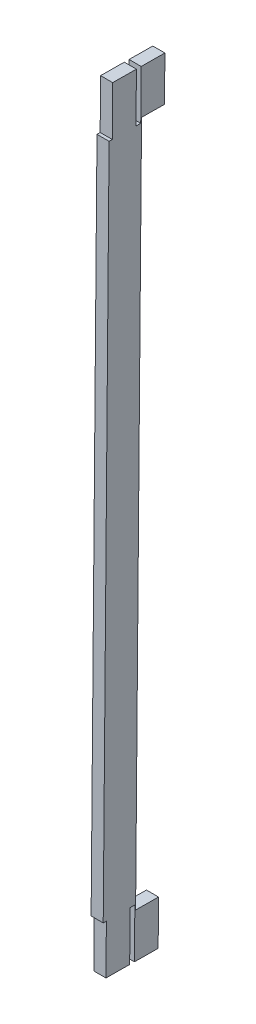
ISO-10303-21;
HEADER;
FILE_DESCRIPTION(('STEP AP214'),'2;1');
FILE_NAME('part.step','',(''),(''),'','','');
FILE_SCHEMA(('AUTOMOTIVE_DESIGN { 1 0 10303 214 1 1 1 1 }'));
ENDSEC;
DATA;
#1=APPLICATION_CONTEXT('core data for automotive mechanical design processes');
#2=APPLICATION_PROTOCOL_DEFINITION('international standard','automotive_design',2000,#1);
#3=PRODUCT_CONTEXT('',#1,'mechanical');
#4=PRODUCT('Part','Part','',(#3));
#5=PRODUCT_RELATED_PRODUCT_CATEGORY('part','',(#4));
#6=PRODUCT_DEFINITION_FORMATION('','',#4);
#7=PRODUCT_DEFINITION_CONTEXT('part definition',#1,'design');
#8=PRODUCT_DEFINITION('design','',#6,#7);
#9=PRODUCT_DEFINITION_SHAPE('','',#8);
#10=(LENGTH_UNIT() NAMED_UNIT(*) SI_UNIT(.MILLI.,.METRE.));
#11=(NAMED_UNIT(*) PLANE_ANGLE_UNIT() SI_UNIT($,.RADIAN.));
#12=(NAMED_UNIT(*) SI_UNIT($,.STERADIAN.) SOLID_ANGLE_UNIT());
#13=UNCERTAINTY_MEASURE_WITH_UNIT(LENGTH_MEASURE(1.E-05),#10,'distance_accuracy_value','');
#14=(GEOMETRIC_REPRESENTATION_CONTEXT(3) GLOBAL_UNCERTAINTY_ASSIGNED_CONTEXT((#13)) GLOBAL_UNIT_ASSIGNED_CONTEXT((#10,
#11,#12)) REPRESENTATION_CONTEXT('',''));
#15=CARTESIAN_POINT('',(0.,0.,0.));
#16=DIRECTION('',(0.,0.,1.));
#17=DIRECTION('',(1.,0.,0.));
#18=AXIS2_PLACEMENT_3D('',#15,#16,#17);
#19=CARTESIAN_POINT('',(445.899457677506,737.587476693191,961.484141215492));
#20=DIRECTION('',(0.,-0.00872653549836428,-0.999961923064171));
#21=DIRECTION('',(0.,0.999961923064171,-0.00872653549836428));
#22=AXIS2_PLACEMENT_3D('',#19,#20,#21);
#23=PLANE('',#22);
#24=DIRECTION('',(0.,0.999961923064171,-0.00872653549836428));
#25=VECTOR('',#24,1.);
#26=CARTESIAN_POINT('',(453.543651110175,737.587476693191,961.484141215492));
#27=LINE('',#26,#25);
#28=CARTESIAN_POINT('',(453.543651110175,493.596767465534,963.613415877093));
#29=VERTEX_POINT('',#28);
#30=CARTESIAN_POINT('',(453.543651110175,521.59570131133,963.369072883139));
#31=VERTEX_POINT('',#30);
#32=EDGE_CURVE('E184',#29,#31,#27,.T.);
#33=ORIENTED_EDGE('',*,*,#32,.F.);
#34=DIRECTION('',(1.,0.,0.));
#35=VECTOR('',#34,1.);
#36=CARTESIAN_POINT('',(445.899457677506,493.596767465534,963.613415877093));
#37=LINE('',#36,#35);
#38=CARTESIAN_POINT('',(445.899457677506,493.596767465534,963.613415877093));
#39=VERTEX_POINT('',#38);
#40=EDGE_CURVE('E32',#39,#29,#37,.T.);
#41=ORIENTED_EDGE('',*,*,#40,.F.);
#42=DIRECTION('',(0.,0.999961923064171,-0.00872653549836428));
#43=VECTOR('',#42,1.);
#44=CARTESIAN_POINT('',(445.899457677506,737.587476693191,961.484141215492));
#45=LINE('',#44,#43);
#46=CARTESIAN_POINT('',(445.899457677506,521.59570131133,963.369072883139));
#47=VERTEX_POINT('',#46);
#48=EDGE_CURVE('E240',#39,#47,#45,.T.);
#49=ORIENTED_EDGE('',*,*,#48,.T.);
#50=DIRECTION('',(1.,0.,0.));
#51=VECTOR('',#50,1.);
#52=CARTESIAN_POINT('',(445.899457677506,521.59570131133,963.369072883139));
#53=LINE('',#52,#51);
#54=EDGE_CURVE('E10',#47,#31,#53,.T.);
#55=ORIENTED_EDGE('',*,*,#54,.T.);
#56=EDGE_LOOP('',(#33,#41,#49,#55));
#57=FACE_BOUND('',#56,.T.);
#58=ADVANCED_FACE('F16',(#57),#23,.T.);
#59=CARTESIAN_POINT('',(445.899457677506,519.83730440841,761.876745385709));
#60=DIRECTION('',(0.,0.999961923064171,-0.008726535498364));
#61=DIRECTION('',(0.,0.008726535498364,0.999961923064171));
#62=AXIS2_PLACEMENT_3D('',#59,#60,#61);
#63=PLANE('',#62);
#64=DIRECTION('',(0.,0.008726535498364,0.999961923064171));
#65=VECTOR('',#64,1.);
#66=CARTESIAN_POINT('',(453.543651110175,519.83730440841,761.876745385709));
#67=LINE('',#66,#65);
#68=CARTESIAN_POINT('',(453.543651110175,521.722236076056,977.86852076757));
#69=VERTEX_POINT('',#68);
#70=EDGE_CURVE('E187',#31,#69,#67,.T.);
#71=ORIENTED_EDGE('',*,*,#70,.F.);
#72=ORIENTED_EDGE('',*,*,#54,.F.);
#73=DIRECTION('',(0.,0.008726535498364,0.999961923064171));
#74=VECTOR('',#73,1.);
#75=CARTESIAN_POINT('',(445.899457677506,519.83730440841,761.876745385709));
#76=LINE('',#75,#74);
#77=CARTESIAN_POINT('',(445.899457677506,521.722236076056,977.86852076757));
#78=VERTEX_POINT('',#77);
#79=EDGE_CURVE('E273',#47,#78,#76,.T.);
#80=ORIENTED_EDGE('',*,*,#79,.T.);
#81=DIRECTION('',(1.,0.,0.));
#82=VECTOR('',#81,1.);
#83=CARTESIAN_POINT('',(445.899457677506,521.722236076056,977.86852076757));
#84=LINE('',#83,#82);
#85=EDGE_CURVE('E24',#78,#69,#84,.T.);
#86=ORIENTED_EDGE('',*,*,#85,.T.);
#87=EDGE_LOOP('',(#71,#72,#80,#86));
#88=FACE_BOUND('',#87,.T.);
#89=ADVANCED_FACE('F272',(#88),#63,.T.);
#90=CARTESIAN_POINT('',(445.899457677506,737.714011457917,975.983589099923));
#91=DIRECTION('',(0.,-0.008726535498364,-0.999961923064171));
#92=DIRECTION('',(0.,0.999961923064171,-0.008726535498364));
#93=AXIS2_PLACEMENT_3D('',#90,#91,#92);
#94=PLANE('',#93);
#95=DIRECTION('',(0.,0.999961923064171,-0.008726535498364));
#96=VECTOR('',#95,1.);
#97=CARTESIAN_POINT('',(453.543651110175,737.714011457917,975.983589099923));
#98=LINE('',#97,#96);
#99=CARTESIAN_POINT('',(453.543651110175,953.705786839779,974.098657432277));
#100=VERTEX_POINT('',#99);
#101=EDGE_CURVE('E190',#69,#100,#98,.T.);
#102=ORIENTED_EDGE('',*,*,#101,.F.);
#103=ORIENTED_EDGE('',*,*,#85,.F.);
#104=DIRECTION('',(0.,0.999961923064171,-0.008726535498364));
#105=VECTOR('',#104,1.);
#106=CARTESIAN_POINT('',(445.899457677506,737.714011457917,975.983589099923));
#107=LINE('',#106,#105);
#108=CARTESIAN_POINT('',(445.899457677506,953.705786839779,974.098657432277));
#109=VERTEX_POINT('',#108);
#110=EDGE_CURVE('E282',#78,#109,#107,.T.);
#111=ORIENTED_EDGE('',*,*,#110,.T.);
#112=DIRECTION('',(1.,0.,0.));
#113=VECTOR('',#112,1.);
#114=CARTESIAN_POINT('',(445.899457677506,953.705786839779,974.098657432277));
#115=LINE('',#114,#113);
#116=EDGE_CURVE('E270',#109,#100,#115,.T.);
#117=ORIENTED_EDGE('',*,*,#116,.T.);
#118=EDGE_LOOP('',(#102,#103,#111,#117));
#119=FACE_BOUND('',#118,.T.);
#120=ADVANCED_FACE('F277',(#119),#94,.T.);
#121=CARTESIAN_POINT('',(445.899457677506,951.820855172132,758.106882050416));
#122=DIRECTION('',(0.,-0.999961923064171,0.008726535498364));
#123=DIRECTION('',(0.,-0.008726535498364,-0.999961923064171));
#124=AXIS2_PLACEMENT_3D('',#121,#122,#123);
#125=PLANE('',#124);
#126=DIRECTION('',(0.,-0.008726535498364,-0.999961923064171));
#127=VECTOR('',#126,1.);
#128=CARTESIAN_POINT('',(453.543651110175,951.820855172132,758.106882050416));
#129=LINE('',#128,#127);
#130=CARTESIAN_POINT('',(453.543651110175,953.579252075052,959.599209547846));
#131=VERTEX_POINT('',#130);
#132=EDGE_CURVE('E193',#100,#131,#129,.T.);
#133=ORIENTED_EDGE('',*,*,#132,.F.);
#134=ORIENTED_EDGE('',*,*,#116,.F.);
#135=DIRECTION('',(0.,-0.008726535498364,-0.999961923064171));
#136=VECTOR('',#135,1.);
#137=CARTESIAN_POINT('',(445.899457677506,951.820855172132,758.106882050416));
#138=LINE('',#137,#136);
#139=CARTESIAN_POINT('',(445.899457677506,953.579252075052,959.599209547846));
#140=VERTEX_POINT('',#139);
#141=EDGE_CURVE('E286',#109,#140,#138,.T.);
#142=ORIENTED_EDGE('',*,*,#141,.T.);
#143=DIRECTION('',(1.,0.,0.));
#144=VECTOR('',#143,1.);
#145=CARTESIAN_POINT('',(445.899457677506,953.579252075052,959.599209547846));
#146=LINE('',#145,#144);
#147=EDGE_CURVE('E268',#140,#131,#146,.T.);
#148=ORIENTED_EDGE('',*,*,#147,.T.);
#149=EDGE_LOOP('',(#133,#134,#142,#148));
#150=FACE_BOUND('',#149,.T.);
#151=ADVANCED_FACE('F377',(#150),#125,.T.);
#152=CARTESIAN_POINT('',(445.899457677506,737.587476693191,961.484141215493));
#153=DIRECTION('',(0.,-0.00872653549836404,-0.999961923064171));
#154=DIRECTION('',(0.,0.999961923064171,-0.00872653549836404));
#155=AXIS2_PLACEMENT_3D('',#152,#153,#154);
#156=PLANE('',#155);
#157=DIRECTION('',(0.,0.999961923064171,-0.00872653549836404));
#158=VECTOR('',#157,1.);
#159=CARTESIAN_POINT('',(453.543651110175,737.587476693191,961.484141215493));
#160=LINE('',#159,#158);
#161=CARTESIAN_POINT('',(453.543651110175,981.57818592085,959.354866553892));
#162=VERTEX_POINT('',#161);
#163=EDGE_CURVE('E196',#131,#162,#160,.T.);
#164=ORIENTED_EDGE('',*,*,#163,.F.);
#165=ORIENTED_EDGE('',*,*,#147,.F.);
#166=DIRECTION('',(0.,0.999961923064171,-0.00872653549836404));
#167=VECTOR('',#166,1.);
#168=CARTESIAN_POINT('',(445.899457677506,737.587476693191,961.484141215493));
#169=LINE('',#168,#167);
#170=CARTESIAN_POINT('',(445.899457677506,981.57818592085,959.354866553892));
#171=VERTEX_POINT('',#170);
#172=EDGE_CURVE('E289',#140,#171,#169,.T.);
#173=ORIENTED_EDGE('',*,*,#172,.T.);
#174=DIRECTION('',(1.,0.,0.));
#175=VECTOR('',#174,1.);
#176=CARTESIAN_POINT('',(445.899457677506,981.57818592085,959.354866553892));
#177=LINE('',#176,#175);
#178=EDGE_CURVE('E266',#171,#162,#177,.T.);
#179=ORIENTED_EDGE('',*,*,#178,.T.);
#180=EDGE_LOOP('',(#164,#165,#173,#179));
#181=FACE_BOUND('',#180,.T.);
#182=ADVANCED_FACE('F374',(#181),#156,.T.);
#183=CARTESIAN_POINT('',(445.899457677506,979.81978901793,757.862539056462));
#184=DIRECTION('',(0.,0.999961923064171,-0.00872653549836404));
#185=DIRECTION('',(0.,0.00872653549836404,0.999961923064171));
#186=AXIS2_PLACEMENT_3D('',#183,#184,#185);
#187=PLANE('',#186);
#188=DIRECTION('',(0.,0.00872653549836404,0.999961923064171));
#189=VECTOR('',#188,1.);
#190=CARTESIAN_POINT('',(453.543651110175,979.81978901793,757.862539056462));
#191=LINE('',#190,#189);
#192=CARTESIAN_POINT('',(453.543651110175,981.709083953326,974.354295399855));
#193=VERTEX_POINT('',#192);
#194=EDGE_CURVE('E199',#162,#193,#191,.T.);
#195=ORIENTED_EDGE('',*,*,#194,.F.);
#196=ORIENTED_EDGE('',*,*,#178,.F.);
#197=DIRECTION('',(0.,0.00872653549836404,0.999961923064171));
#198=VECTOR('',#197,1.);
#199=CARTESIAN_POINT('',(445.899457677506,979.81978901793,757.862539056462));
#200=LINE('',#199,#198);
#201=CARTESIAN_POINT('',(445.899457677506,981.709083953326,974.354295399855));
#202=VERTEX_POINT('',#201);
#203=EDGE_CURVE('E292',#171,#202,#200,.T.);
#204=ORIENTED_EDGE('',*,*,#203,.T.);
#205=DIRECTION('',(1.,0.,0.));
#206=VECTOR('',#205,1.);
#207=CARTESIAN_POINT('',(445.899457677506,981.709083953326,974.354295399855));
#208=LINE('',#207,#206);
#209=EDGE_CURVE('E264',#202,#193,#208,.T.);
#210=ORIENTED_EDGE('',*,*,#209,.T.);
#211=EDGE_LOOP('',(#195,#196,#204,#210));
#212=FACE_BOUND('',#211,.T.);
#213=ADVANCED_FACE('F371',(#212),#187,.T.);
#214=CARTESIAN_POINT('',(445.899457677506,737.718374725667,976.483570061455));
#215=DIRECTION('',(0.,0.00872653549836404,0.999961923064171));
#216=DIRECTION('',(0.,-0.999961923064171,0.00872653549836404));
#217=AXIS2_PLACEMENT_3D('',#214,#215,#216);
#218=PLANE('',#217);
#219=DIRECTION('',(0.,-0.999961923064171,0.00872653549836404));
#220=VECTOR('',#219,1.);
#221=CARTESIAN_POINT('',(453.543651110175,737.718374725667,976.483570061455));
#222=LINE('',#221,#220);
#223=CARTESIAN_POINT('',(453.543651110175,950.710264338337,974.624818000304));
#224=VERTEX_POINT('',#223);
#225=EDGE_CURVE('E202',#193,#224,#222,.T.);
#226=ORIENTED_EDGE('',*,*,#225,.F.);
#227=ORIENTED_EDGE('',*,*,#209,.F.);
#228=DIRECTION('',(0.,-0.999961923064171,0.00872653549836404));
#229=VECTOR('',#228,1.);
#230=CARTESIAN_POINT('',(445.899457677506,737.718374725667,976.483570061455));
#231=LINE('',#230,#229);
#232=CARTESIAN_POINT('',(445.899457677506,950.710264338337,974.624818000304));
#233=VERTEX_POINT('',#232);
#234=EDGE_CURVE('E295',#202,#233,#231,.T.);
#235=ORIENTED_EDGE('',*,*,#234,.T.);
#236=DIRECTION('',(1.,0.,0.));
#237=VECTOR('',#236,1.);
#238=CARTESIAN_POINT('',(445.899457677506,950.710264338337,974.624818000304));
#239=LINE('',#238,#237);
#240=EDGE_CURVE('E262',#233,#224,#239,.T.);
#241=ORIENTED_EDGE('',*,*,#240,.T.);
#242=EDGE_LOOP('',(#226,#227,#235,#241));
#243=FACE_BOUND('',#242,.T.);
#244=ADVANCED_FACE('F368',(#243),#218,.T.);
#245=CARTESIAN_POINT('',(445.899457677506,948.820969402941,758.133061656911));
#246=DIRECTION('',(0.,-0.999961923064171,0.00872653549836404));
#247=DIRECTION('',(0.,-0.00872653549836404,-0.999961923064171));
#248=AXIS2_PLACEMENT_3D('',#245,#246,#247);
#249=PLANE('',#248);
#250=DIRECTION('',(0.,-0.00872653549836404,-0.999961923064171));
#251=VECTOR('',#250,1.);
#252=CARTESIAN_POINT('',(453.543651110175,948.820969402941,758.133061656911));
#253=LINE('',#252,#251);
#254=CARTESIAN_POINT('',(453.543651110175,950.736443944832,977.624703769496));
#255=VERTEX_POINT('',#254);
#256=EDGE_CURVE('E205',#255,#224,#253,.T.);
#257=ORIENTED_EDGE('',*,*,#256,.T.);
#258=ORIENTED_EDGE('',*,*,#240,.F.);
#259=DIRECTION('',(0.,-0.00872653549836404,-0.999961923064171));
#260=VECTOR('',#259,1.);
#261=CARTESIAN_POINT('',(445.899457677506,948.820969402941,758.133061656911));
#262=LINE('',#261,#260);
#263=CARTESIAN_POINT('',(445.899457677506,950.736443944832,977.624703769496));
#264=VERTEX_POINT('',#263);
#265=EDGE_CURVE('E298',#264,#233,#262,.T.);
#266=ORIENTED_EDGE('',*,*,#265,.F.);
#267=DIRECTION('',(1.,0.,0.));
#268=VECTOR('',#267,1.);
#269=CARTESIAN_POINT('',(445.899457677506,950.736443944832,977.624703769496));
#270=LINE('',#269,#268);
#271=EDGE_CURVE('E260',#264,#255,#270,.T.);
#272=ORIENTED_EDGE('',*,*,#271,.T.);
#273=EDGE_LOOP('',(#257,#258,#266,#272));
#274=FACE_BOUND('',#273,.T.);
#275=ADVANCED_FACE('F362',(#274),#249,.F.);
#276=CARTESIAN_POINT('',(445.899457677506,737.744554332162,979.483455830648));
#277=DIRECTION('',(0.,-0.00872653549836404,-0.999961923064171));
#278=DIRECTION('',(0.,0.999961923064171,-0.00872653549836404));
#279=AXIS2_PLACEMENT_3D('',#276,#277,#278);
#280=PLANE('',#279);
#281=DIRECTION('',(0.,0.999961923064171,-0.00872653549836404));
#282=VECTOR('',#281,1.);
#283=CARTESIAN_POINT('',(453.543651110175,737.744554332162,979.483455830648));
#284=LINE('',#283,#282);
#285=CARTESIAN_POINT('',(453.543651110175,981.735263559821,977.354181169047));
#286=VERTEX_POINT('',#285);
#287=EDGE_CURVE('E208',#255,#286,#284,.T.);
#288=ORIENTED_EDGE('',*,*,#287,.F.);
#289=ORIENTED_EDGE('',*,*,#271,.F.);
#290=DIRECTION('',(0.,0.999961923064171,-0.00872653549836404));
#291=VECTOR('',#290,1.);
#292=CARTESIAN_POINT('',(445.899457677506,737.744554332162,979.483455830648));
#293=LINE('',#292,#291);
#294=CARTESIAN_POINT('',(445.899457677506,981.735263559821,977.354181169047));
#295=VERTEX_POINT('',#294);
#296=EDGE_CURVE('E301',#264,#295,#293,.T.);
#297=ORIENTED_EDGE('',*,*,#296,.T.);
#298=DIRECTION('',(1.,0.,0.));
#299=VECTOR('',#298,1.);
#300=CARTESIAN_POINT('',(445.899457677506,981.735263559821,977.354181169047));
#301=LINE('',#300,#299);
#302=EDGE_CURVE('E258',#295,#286,#301,.T.);
#303=ORIENTED_EDGE('',*,*,#302,.T.);
#304=EDGE_LOOP('',(#288,#289,#297,#303));
#305=FACE_BOUND('',#304,.T.);
#306=ADVANCED_FACE('F358',(#305),#280,.T.);
#307=CARTESIAN_POINT('',(445.899457677506,979.81978901793,757.862539056462));
#308=DIRECTION('',(0.,0.999961923064171,-0.00872653549836404));
#309=DIRECTION('',(0.,0.00872653549836404,0.999961923064171));
#310=AXIS2_PLACEMENT_3D('',#307,#308,#309);
#311=PLANE('',#310);
#312=DIRECTION('',(0.,0.00872653549836404,0.999961923064171));
#313=VECTOR('',#312,1.);
#314=CARTESIAN_POINT('',(453.543651110175,979.81978901793,757.862539056462));
#315=LINE('',#314,#313);
#316=CARTESIAN_POINT('',(453.543651110175,981.866161592296,992.35361001501));
#317=VERTEX_POINT('',#316);
#318=EDGE_CURVE('E211',#286,#317,#315,.T.);
#319=ORIENTED_EDGE('',*,*,#318,.F.);
#320=ORIENTED_EDGE('',*,*,#302,.F.);
#321=DIRECTION('',(0.,0.00872653549836404,0.999961923064171));
#322=VECTOR('',#321,1.);
#323=CARTESIAN_POINT('',(445.899457677506,979.81978901793,757.862539056462));
#324=LINE('',#323,#322);
#325=CARTESIAN_POINT('',(445.899457677506,981.866161592296,992.35361001501));
#326=VERTEX_POINT('',#325);
#327=EDGE_CURVE('E304',#295,#326,#324,.T.);
#328=ORIENTED_EDGE('',*,*,#327,.T.);
#329=DIRECTION('',(1.,0.,0.));
#330=VECTOR('',#329,1.);
#331=CARTESIAN_POINT('',(445.899457677506,981.866161592296,992.35361001501));
#332=LINE('',#331,#330);
#333=EDGE_CURVE('E256',#326,#317,#332,.T.);
#334=ORIENTED_EDGE('',*,*,#333,.T.);
#335=EDGE_LOOP('',(#319,#320,#328,#334));
#336=FACE_BOUND('',#335,.T.);
#337=ADVANCED_FACE('F355',(#336),#311,.T.);
#338=CARTESIAN_POINT('',(445.899457677506,737.875452364637,994.482884676611));
#339=DIRECTION('',(0.,0.00872653549836404,0.999961923064171));
#340=DIRECTION('',(0.,-0.999961923064171,0.00872653549836404));
#341=AXIS2_PLACEMENT_3D('',#338,#339,#340);
#342=PLANE('',#341);
#343=DIRECTION('',(0.,-0.999961923064171,0.00872653549836404));
#344=VECTOR('',#343,1.);
#345=CARTESIAN_POINT('',(453.543651110175,737.875452364637,994.482884676611));
#346=LINE('',#345,#344);
#347=CARTESIAN_POINT('',(453.543651110175,950.867341977307,992.624132615459));
#348=VERTEX_POINT('',#347);
#349=EDGE_CURVE('E214',#317,#348,#346,.T.);
#350=ORIENTED_EDGE('',*,*,#349,.F.);
#351=ORIENTED_EDGE('',*,*,#333,.F.);
#352=DIRECTION('',(0.,-0.999961923064171,0.00872653549836404));
#353=VECTOR('',#352,1.);
#354=CARTESIAN_POINT('',(445.899457677506,737.875452364637,994.482884676611));
#355=LINE('',#354,#353);
#356=CARTESIAN_POINT('',(445.899457677506,950.867341977307,992.624132615459));
#357=VERTEX_POINT('',#356);
#358=EDGE_CURVE('E307',#326,#357,#355,.T.);
#359=ORIENTED_EDGE('',*,*,#358,.T.);
#360=DIRECTION('',(1.,0.,0.));
#361=VECTOR('',#360,1.);
#362=CARTESIAN_POINT('',(445.899457677506,950.867341977307,992.624132615459));
#363=LINE('',#362,#361);
#364=EDGE_CURVE('E254',#357,#348,#363,.T.);
#365=ORIENTED_EDGE('',*,*,#364,.T.);
#366=EDGE_LOOP('',(#350,#351,#359,#365));
#367=FACE_BOUND('',#366,.T.);
#368=ADVANCED_FACE('F350',(#367),#342,.T.);
#369=CARTESIAN_POINT('',(445.899457677506,948.820969402941,758.133061656911));
#370=DIRECTION('',(0.,-0.999961923064171,0.00872653549836404));
#371=DIRECTION('',(0.,-0.00872653549836404,-0.999961923064171));
#372=AXIS2_PLACEMENT_3D('',#369,#370,#371);
#373=PLANE('',#372);
#374=DIRECTION('',(0.,-0.00872653549836404,-0.999961923064171));
#375=VECTOR('',#374,1.);
#376=CARTESIAN_POINT('',(453.543651110175,948.820969402941,758.133061656911));
#377=LINE('',#376,#375);
#378=CARTESIAN_POINT('',(453.543651110175,950.884795048304,994.624056461587));
#379=VERTEX_POINT('',#378);
#380=EDGE_CURVE('E217',#379,#348,#377,.T.);
#381=ORIENTED_EDGE('',*,*,#380,.T.);
#382=ORIENTED_EDGE('',*,*,#364,.F.);
#383=DIRECTION('',(0.,-0.00872653549836404,-0.999961923064171));
#384=VECTOR('',#383,1.);
#385=CARTESIAN_POINT('',(445.899457677506,948.820969402941,758.133061656911));
#386=LINE('',#385,#384);
#387=CARTESIAN_POINT('',(445.899457677506,950.884795048304,994.624056461587));
#388=VERTEX_POINT('',#387);
#389=EDGE_CURVE('E310',#388,#357,#386,.T.);
#390=ORIENTED_EDGE('',*,*,#389,.F.);
#391=DIRECTION('',(1.,0.,0.));
#392=VECTOR('',#391,1.);
#393=CARTESIAN_POINT('',(445.899457677506,950.884795048304,994.624056461587));
#394=LINE('',#393,#392);
#395=EDGE_CURVE('E252',#388,#379,#394,.T.);
#396=ORIENTED_EDGE('',*,*,#395,.T.);
#397=EDGE_LOOP('',(#381,#382,#390,#396));
#398=FACE_BOUND('',#397,.T.);
#399=ADVANCED_FACE('F347',(#398),#373,.F.);
#400=CARTESIAN_POINT('',(445.899457677506,737.892905435634,996.482808522739));
#401=DIRECTION('',(0.,0.00872653549836416,0.999961923064171));
#402=DIRECTION('',(0.,-0.999961923064171,0.00872653549836416));
#403=AXIS2_PLACEMENT_3D('',#400,#401,#402);
#404=PLANE('',#403);
#405=DIRECTION('',(0.,-0.999961923064171,0.00872653549836416));
#406=VECTOR('',#405,1.);
#407=CARTESIAN_POINT('',(453.543651110175,737.892905435634,996.482808522739));
#408=LINE('',#407,#406);
#409=CARTESIAN_POINT('',(453.543651110175,524.901015822966,998.34156058389));
#410=VERTEX_POINT('',#409);
#411=EDGE_CURVE('E220',#379,#410,#408,.T.);
#412=ORIENTED_EDGE('',*,*,#411,.F.);
#413=ORIENTED_EDGE('',*,*,#395,.F.);
#414=DIRECTION('',(0.,-0.999961923064171,0.00872653549836416));
#415=VECTOR('',#414,1.);
#416=CARTESIAN_POINT('',(445.899457677506,737.892905435634,996.482808522739));
#417=LINE('',#416,#415);
#418=CARTESIAN_POINT('',(445.899457677506,524.901015822966,998.34156058389));
#419=VERTEX_POINT('',#418);
#420=EDGE_CURVE('E313',#388,#419,#417,.T.);
#421=ORIENTED_EDGE('',*,*,#420,.T.);
#422=DIRECTION('',(1.,0.,0.));
#423=VECTOR('',#422,1.);
#424=CARTESIAN_POINT('',(445.899457677506,524.901015822966,998.34156058389));
#425=LINE('',#424,#423);
#426=EDGE_CURVE('E250',#419,#410,#425,.T.);
#427=ORIENTED_EDGE('',*,*,#426,.T.);
#428=EDGE_LOOP('',(#412,#413,#421,#427));
#429=FACE_BOUND('',#428,.T.);
#430=ADVANCED_FACE('F344',(#429),#404,.T.);
#431=CARTESIAN_POINT('',(445.899457677506,522.837190177603,761.850565779214));
#432=DIRECTION('',(0.,0.999961923064171,-0.00872653549836428));
#433=DIRECTION('',(0.,0.00872653549836428,0.999961923064171));
#434=AXIS2_PLACEMENT_3D('',#431,#432,#433);
#435=PLANE('',#434);
#436=DIRECTION('',(0.,0.00872653549836428,0.999961923064171));
#437=VECTOR('',#436,1.);
#438=CARTESIAN_POINT('',(453.543651110175,522.837190177603,761.850565779214));
#439=LINE('',#438,#437);
#440=CARTESIAN_POINT('',(453.543651110175,524.88356275197,996.341636737761));
#441=VERTEX_POINT('',#440);
#442=EDGE_CURVE('E223',#441,#410,#439,.T.);
#443=ORIENTED_EDGE('',*,*,#442,.T.);
#444=ORIENTED_EDGE('',*,*,#426,.F.);
#445=DIRECTION('',(0.,0.00872653549836428,0.999961923064171));
#446=VECTOR('',#445,1.);
#447=CARTESIAN_POINT('',(445.899457677506,522.837190177603,761.850565779214));
#448=LINE('',#447,#446);
#449=CARTESIAN_POINT('',(445.899457677506,524.88356275197,996.341636737761));
#450=VERTEX_POINT('',#449);
#451=EDGE_CURVE('E316',#450,#419,#448,.T.);
#452=ORIENTED_EDGE('',*,*,#451,.F.);
#453=DIRECTION('',(1.,0.,0.));
#454=VECTOR('',#453,1.);
#455=CARTESIAN_POINT('',(445.899457677506,524.88356275197,996.341636737761));
#456=LINE('',#455,#454);
#457=EDGE_CURVE('E248',#450,#441,#456,.T.);
#458=ORIENTED_EDGE('',*,*,#457,.T.);
#459=EDGE_LOOP('',(#443,#444,#452,#458));
#460=FACE_BOUND('',#459,.T.);
#461=ADVANCED_FACE('F338',(#460),#435,.F.);
#462=CARTESIAN_POINT('',(445.899457677506,737.875452364637,994.48288467661));
#463=DIRECTION('',(0.,0.00872653549836428,0.999961923064171));
#464=DIRECTION('',(0.,-0.999961923064171,0.00872653549836428));
#465=AXIS2_PLACEMENT_3D('',#462,#463,#464);
#466=PLANE('',#465);
#467=DIRECTION('',(0.,-0.999961923064171,0.00872653549836428));
#468=VECTOR('',#467,1.);
#469=CARTESIAN_POINT('',(453.543651110175,737.875452364637,994.48288467661));
#470=LINE('',#469,#468);
#471=CARTESIAN_POINT('',(453.543651110175,493.88474313698,996.612159338211));
#472=VERTEX_POINT('',#471);
#473=EDGE_CURVE('E226',#441,#472,#470,.T.);
#474=ORIENTED_EDGE('',*,*,#473,.F.);
#475=ORIENTED_EDGE('',*,*,#457,.F.);
#476=DIRECTION('',(0.,-0.999961923064171,0.00872653549836428));
#477=VECTOR('',#476,1.);
#478=CARTESIAN_POINT('',(445.899457677506,737.875452364637,994.48288467661));
#479=LINE('',#478,#477);
#480=CARTESIAN_POINT('',(445.899457677506,493.88474313698,996.612159338211));
#481=VERTEX_POINT('',#480);
#482=EDGE_CURVE('E319',#450,#481,#479,.T.);
#483=ORIENTED_EDGE('',*,*,#482,.T.);
#484=DIRECTION('',(1.,0.,0.));
#485=VECTOR('',#484,1.);
#486=CARTESIAN_POINT('',(445.899457677506,493.88474313698,996.612159338211));
#487=LINE('',#486,#485);
#488=EDGE_CURVE('E246',#481,#472,#487,.T.);
#489=ORIENTED_EDGE('',*,*,#488,.T.);
#490=EDGE_LOOP('',(#474,#475,#483,#489));
#491=FACE_BOUND('',#490,.T.);
#492=ADVANCED_FACE('F334',(#491),#466,.T.);
#493=CARTESIAN_POINT('',(445.899457677506,491.838370562614,762.121088379663));
#494=DIRECTION('',(0.,-0.999961923064171,0.00872653549836428));
#495=DIRECTION('',(0.,-0.00872653549836428,-0.999961923064171));
#496=AXIS2_PLACEMENT_3D('',#493,#494,#495);
#497=PLANE('',#496);
#498=DIRECTION('',(0.,-0.00872653549836428,-0.999961923064171));
#499=VECTOR('',#498,1.);
#500=CARTESIAN_POINT('',(453.543651110175,491.838370562614,762.121088379663));
#501=LINE('',#500,#499);
#502=CARTESIAN_POINT('',(453.543651110175,493.753845104505,981.612730492248));
#503=VERTEX_POINT('',#502);
#504=EDGE_CURVE('E229',#472,#503,#501,.T.);
#505=ORIENTED_EDGE('',*,*,#504,.F.);
#506=ORIENTED_EDGE('',*,*,#488,.F.);
#507=DIRECTION('',(0.,-0.00872653549836428,-0.999961923064171));
#508=VECTOR('',#507,1.);
#509=CARTESIAN_POINT('',(445.899457677506,491.838370562614,762.121088379663));
#510=LINE('',#509,#508);
#511=CARTESIAN_POINT('',(445.899457677506,493.753845104505,981.612730492248));
#512=VERTEX_POINT('',#511);
#513=EDGE_CURVE('E322',#481,#512,#510,.T.);
#514=ORIENTED_EDGE('',*,*,#513,.T.);
#515=DIRECTION('',(1.,0.,0.));
#516=VECTOR('',#515,1.);
#517=CARTESIAN_POINT('',(445.899457677506,493.753845104505,981.612730492248));
#518=LINE('',#517,#516);
#519=EDGE_CURVE('E244',#512,#503,#518,.T.);
#520=ORIENTED_EDGE('',*,*,#519,.T.);
#521=EDGE_LOOP('',(#505,#506,#514,#520));
#522=FACE_BOUND('',#521,.T.);
#523=ADVANCED_FACE('F331',(#522),#497,.T.);
#524=CARTESIAN_POINT('',(445.899457677506,737.744554332162,979.483455830647));
#525=DIRECTION('',(0.,-0.00872653549836428,-0.999961923064171));
#526=DIRECTION('',(0.,0.999961923064171,-0.00872653549836428));
#527=AXIS2_PLACEMENT_3D('',#524,#525,#526);
#528=PLANE('',#527);
#529=DIRECTION('',(0.,0.999961923064171,-0.00872653549836428));
#530=VECTOR('',#529,1.);
#531=CARTESIAN_POINT('',(453.543651110175,737.744554332162,979.483455830647));
#532=LINE('',#531,#530);
#533=CARTESIAN_POINT('',(453.543651110175,524.752664719494,981.342207891799));
#534=VERTEX_POINT('',#533);
#535=EDGE_CURVE('E232',#503,#534,#532,.T.);
#536=ORIENTED_EDGE('',*,*,#535,.F.);
#537=ORIENTED_EDGE('',*,*,#519,.F.);
#538=DIRECTION('',(0.,0.999961923064171,-0.00872653549836428));
#539=VECTOR('',#538,1.);
#540=CARTESIAN_POINT('',(445.899457677506,737.744554332162,979.483455830647));
#541=LINE('',#540,#539);
#542=CARTESIAN_POINT('',(445.899457677506,524.752664719494,981.342207891799));
#543=VERTEX_POINT('',#542);
#544=EDGE_CURVE('E175',#512,#543,#541,.T.);
#545=ORIENTED_EDGE('',*,*,#544,.T.);
#546=DIRECTION('',(1.,0.,0.));
#547=VECTOR('',#546,1.);
#548=CARTESIAN_POINT('',(445.899457677506,524.752664719494,981.342207891799));
#549=LINE('',#548,#547);
#550=EDGE_CURVE('E167',#543,#534,#549,.T.);
#551=ORIENTED_EDGE('',*,*,#550,.T.);
#552=EDGE_LOOP('',(#536,#537,#545,#551));
#553=FACE_BOUND('',#552,.T.);
#554=ADVANCED_FACE('F326',(#553),#528,.T.);
#555=CARTESIAN_POINT('',(445.899457677506,522.837190177603,761.850565779214));
#556=DIRECTION('',(0.,0.999961923064171,-0.00872653549836428));
#557=DIRECTION('',(0.,0.00872653549836428,0.999961923064171));
#558=AXIS2_PLACEMENT_3D('',#555,#556,#557);
#559=PLANE('',#558);
#560=DIRECTION('',(0.,0.00872653549836428,0.999961923064171));
#561=VECTOR('',#560,1.);
#562=CARTESIAN_POINT('',(453.543651110175,522.837190177603,761.850565779214));
#563=LINE('',#562,#561);
#564=CARTESIAN_POINT('',(453.543651110175,524.726485112999,978.342322122606));
#565=VERTEX_POINT('',#564);
#566=EDGE_CURVE('E235',#565,#534,#563,.T.);
#567=ORIENTED_EDGE('',*,*,#566,.T.);
#568=ORIENTED_EDGE('',*,*,#550,.F.);
#569=DIRECTION('',(0.,0.00872653549836428,0.999961923064171));
#570=VECTOR('',#569,1.);
#571=CARTESIAN_POINT('',(445.899457677506,522.837190177603,761.850565779214));
#572=LINE('',#571,#570);
#573=CARTESIAN_POINT('',(445.899457677506,524.726485112999,978.342322122606));
#574=VERTEX_POINT('',#573);
#575=EDGE_CURVE('E170',#574,#543,#572,.T.);
#576=ORIENTED_EDGE('',*,*,#575,.F.);
#577=DIRECTION('',(1.,0.,0.));
#578=VECTOR('',#577,1.);
#579=CARTESIAN_POINT('',(445.899457677506,524.726485112999,978.342322122606));
#580=LINE('',#579,#578);
#581=EDGE_CURVE('E156',#574,#565,#580,.T.);
#582=ORIENTED_EDGE('',*,*,#581,.T.);
#583=EDGE_LOOP('',(#567,#568,#576,#582));
#584=FACE_BOUND('',#583,.T.);
#585=ADVANCED_FACE('F171',(#584),#559,.F.);
#586=CARTESIAN_POINT('',(445.899457677506,737.718374725667,976.483570061454));
#587=DIRECTION('',(0.,0.00872653549836428,0.999961923064171));
#588=DIRECTION('',(0.,-0.999961923064171,0.00872653549836428));
#589=AXIS2_PLACEMENT_3D('',#586,#587,#588);
#590=PLANE('',#589);
#591=DIRECTION('',(0.,-0.999961923064171,0.00872653549836428));
#592=VECTOR('',#591,1.);
#593=CARTESIAN_POINT('',(453.543651110175,737.718374725667,976.483570061454));
#594=LINE('',#593,#592);
#595=CARTESIAN_POINT('',(453.543651110175,493.72766549801,978.612844723056));
#596=VERTEX_POINT('',#595);
#597=EDGE_CURVE('E163',#565,#596,#594,.T.);
#598=ORIENTED_EDGE('',*,*,#597,.F.);
#599=ORIENTED_EDGE('',*,*,#581,.F.);
#600=DIRECTION('',(0.,-0.999961923064171,0.00872653549836428));
#601=VECTOR('',#600,1.);
#602=CARTESIAN_POINT('',(445.899457677506,737.718374725667,976.483570061454));
#603=LINE('',#602,#601);
#604=CARTESIAN_POINT('',(445.899457677506,493.72766549801,978.612844723056));
#605=VERTEX_POINT('',#604);
#606=EDGE_CURVE('E160',#574,#605,#603,.T.);
#607=ORIENTED_EDGE('',*,*,#606,.T.);
#608=DIRECTION('',(1.,0.,0.));
#609=VECTOR('',#608,1.);
#610=CARTESIAN_POINT('',(445.899457677506,493.72766549801,978.612844723056));
#611=LINE('',#610,#609);
#612=EDGE_CURVE('E96',#605,#596,#611,.T.);
#613=ORIENTED_EDGE('',*,*,#612,.T.);
#614=EDGE_LOOP('',(#598,#599,#607,#613));
#615=FACE_BOUND('',#614,.T.);
#616=ADVANCED_FACE('F158',(#615),#590,.T.);
#617=CARTESIAN_POINT('',(445.899457677506,491.838370562614,762.121088379663));
#618=DIRECTION('',(0.,-0.999961923064171,0.00872653549836428));
#619=DIRECTION('',(0.,-0.00872653549836428,-0.999961923064171));
#620=AXIS2_PLACEMENT_3D('',#617,#618,#619);
#621=PLANE('',#620);
#622=DIRECTION('',(0.,-0.00872653549836428,-0.999961923064171));
#623=VECTOR('',#622,1.);
#624=CARTESIAN_POINT('',(453.543651110175,491.838370562614,762.121088379663));
#625=LINE('',#624,#623);
#626=EDGE_CURVE('E238',#596,#29,#625,.T.);
#627=ORIENTED_EDGE('',*,*,#626,.F.);
#628=ORIENTED_EDGE('',*,*,#612,.F.);
#629=DIRECTION('',(0.,-0.00872653549836428,-0.999961923064171));
#630=VECTOR('',#629,1.);
#631=CARTESIAN_POINT('',(445.899457677506,491.838370562614,762.121088379663));
#632=LINE('',#631,#630);
#633=EDGE_CURVE('E179',#605,#39,#632,.T.);
#634=ORIENTED_EDGE('',*,*,#633,.T.);
#635=ORIENTED_EDGE('',*,*,#40,.T.);
#636=EDGE_LOOP('',(#627,#628,#634,#635));
#637=FACE_BOUND('',#636,.T.);
#638=ADVANCED_FACE('F525',(#637),#621,.T.);
#639=CARTESIAN_POINT('',(445.899457677506,735.829079790271,759.991813718062));
#640=DIRECTION('',(1.,0.,0.));
#641=DIRECTION('',(0.,1.,0.));
#642=AXIS2_PLACEMENT_3D('',#639,#640,#641);
#643=PLANE('',#642);
#644=ORIENTED_EDGE('',*,*,#48,.F.);
#645=ORIENTED_EDGE('',*,*,#633,.F.);
#646=ORIENTED_EDGE('',*,*,#606,.F.);
#647=ORIENTED_EDGE('',*,*,#575,.T.);
#648=ORIENTED_EDGE('',*,*,#544,.F.);
#649=ORIENTED_EDGE('',*,*,#513,.F.);
#650=ORIENTED_EDGE('',*,*,#482,.F.);
#651=ORIENTED_EDGE('',*,*,#451,.T.);
#652=ORIENTED_EDGE('',*,*,#420,.F.);
#653=ORIENTED_EDGE('',*,*,#389,.T.);
#654=ORIENTED_EDGE('',*,*,#358,.F.);
#655=ORIENTED_EDGE('',*,*,#327,.F.);
#656=ORIENTED_EDGE('',*,*,#296,.F.);
#657=ORIENTED_EDGE('',*,*,#265,.T.);
#658=ORIENTED_EDGE('',*,*,#234,.F.);
#659=ORIENTED_EDGE('',*,*,#203,.F.);
#660=ORIENTED_EDGE('',*,*,#172,.F.);
#661=ORIENTED_EDGE('',*,*,#141,.F.);
#662=ORIENTED_EDGE('',*,*,#110,.F.);
#663=ORIENTED_EDGE('',*,*,#79,.F.);
#664=EDGE_LOOP('',(#644,#645,#646,#647,#648,#649,#650,#651,#652,#653,#654,#655,#656,#657,#658,
#659,#660,#661,#662,#663));
#665=FACE_BOUND('',#664,.T.);
#666=ADVANCED_FACE('F178',(#665),#643,.F.);
#667=CARTESIAN_POINT('',(453.543651110175,735.829079790271,759.991813718062));
#668=DIRECTION('',(1.,0.,0.));
#669=DIRECTION('',(0.,1.,0.));
#670=AXIS2_PLACEMENT_3D('',#667,#668,#669);
#671=PLANE('',#670);
#672=ORIENTED_EDGE('',*,*,#32,.T.);
#673=ORIENTED_EDGE('',*,*,#70,.T.);
#674=ORIENTED_EDGE('',*,*,#101,.T.);
#675=ORIENTED_EDGE('',*,*,#132,.T.);
#676=ORIENTED_EDGE('',*,*,#163,.T.);
#677=ORIENTED_EDGE('',*,*,#194,.T.);
#678=ORIENTED_EDGE('',*,*,#225,.T.);
#679=ORIENTED_EDGE('',*,*,#256,.F.);
#680=ORIENTED_EDGE('',*,*,#287,.T.);
#681=ORIENTED_EDGE('',*,*,#318,.T.);
#682=ORIENTED_EDGE('',*,*,#349,.T.);
#683=ORIENTED_EDGE('',*,*,#380,.F.);
#684=ORIENTED_EDGE('',*,*,#411,.T.);
#685=ORIENTED_EDGE('',*,*,#442,.F.);
#686=ORIENTED_EDGE('',*,*,#473,.T.);
#687=ORIENTED_EDGE('',*,*,#504,.T.);
#688=ORIENTED_EDGE('',*,*,#535,.T.);
#689=ORIENTED_EDGE('',*,*,#566,.F.);
#690=ORIENTED_EDGE('',*,*,#597,.T.);
#691=ORIENTED_EDGE('',*,*,#626,.T.);
#692=EDGE_LOOP('',(#672,#673,#674,#675,#676,#677,#678,#679,#680,#681,#682,#683,#684,#685,#686,
#687,#688,#689,#690,#691));
#693=FACE_BOUND('',#692,.T.);
#694=ADVANCED_FACE('F280',(#693),#671,.T.);
#695=CLOSED_SHELL('',(#58,#89,#120,#151,#182,#213,#244,#275,#306,#337,#368,#399,#430,#461,#492,
#523,#554,#585,#616,#638,#666,#694));
#696=MANIFOLD_SOLID_BREP('B1',#695);
#697=ADVANCED_BREP_SHAPE_REPRESENTATION('',(#18,#696),#14);
#698=SHAPE_DEFINITION_REPRESENTATION(#9,#697);
ENDSEC;
END-ISO-10303-21;
